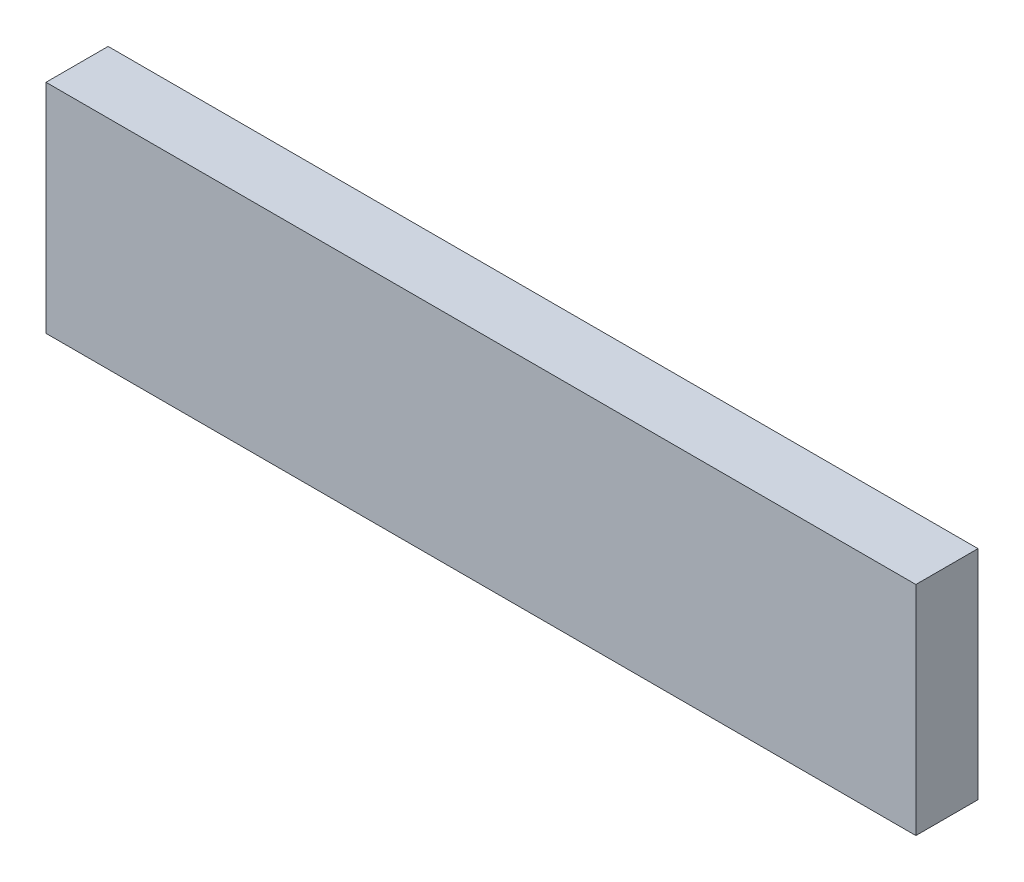
ISO-10303-21;
HEADER;
FILE_DESCRIPTION(('STEP AP214'),'2;1');
FILE_NAME('part.step','',(''),(''),'','','');
FILE_SCHEMA(('AUTOMOTIVE_DESIGN { 1 0 10303 214 1 1 1 1 }'));
ENDSEC;
DATA;
#1=APPLICATION_CONTEXT('core data for automotive mechanical design processes');
#2=APPLICATION_PROTOCOL_DEFINITION('international standard','automotive_design',2000,#1);
#3=PRODUCT_CONTEXT('',#1,'mechanical');
#4=PRODUCT('Part','Part','',(#3));
#5=PRODUCT_RELATED_PRODUCT_CATEGORY('part','',(#4));
#6=PRODUCT_DEFINITION_FORMATION('','',#4);
#7=PRODUCT_DEFINITION_CONTEXT('part definition',#1,'design');
#8=PRODUCT_DEFINITION('design','',#6,#7);
#9=PRODUCT_DEFINITION_SHAPE('','',#8);
#10=(LENGTH_UNIT() NAMED_UNIT(*) SI_UNIT(.MILLI.,.METRE.));
#11=(NAMED_UNIT(*) PLANE_ANGLE_UNIT() SI_UNIT($,.RADIAN.));
#12=(NAMED_UNIT(*) SI_UNIT($,.STERADIAN.) SOLID_ANGLE_UNIT());
#13=UNCERTAINTY_MEASURE_WITH_UNIT(LENGTH_MEASURE(1.E-05),#10,'distance_accuracy_value','');
#14=(GEOMETRIC_REPRESENTATION_CONTEXT(3) GLOBAL_UNCERTAINTY_ASSIGNED_CONTEXT((#13)) GLOBAL_UNIT_ASSIGNED_CONTEXT((#10,
#11,#12)) REPRESENTATION_CONTEXT('',''));
#15=CARTESIAN_POINT('',(0.,0.,0.));
#16=DIRECTION('',(0.,0.,1.));
#17=DIRECTION('',(1.,0.,0.));
#18=AXIS2_PLACEMENT_3D('',#15,#16,#17);
#19=CARTESIAN_POINT('',(140.,-35.,20.));
#20=DIRECTION('',(-1.,0.,0.));
#21=DIRECTION('',(0.,0.,1.));
#22=AXIS2_PLACEMENT_3D('',#19,#20,#21);
#23=PLANE('',#22);
#24=DIRECTION('',(0.,1.,0.));
#25=VECTOR('',#24,1.);
#26=CARTESIAN_POINT('',(140.,-35.,0.));
#27=LINE('',#26,#25);
#28=CARTESIAN_POINT('',(140.,-35.,0.));
#29=VERTEX_POINT('',#28);
#30=CARTESIAN_POINT('',(140.,35.,0.));
#31=VERTEX_POINT('',#30);
#32=EDGE_CURVE('E113',#29,#31,#27,.T.);
#33=ORIENTED_EDGE('',*,*,#32,.T.);
#34=DIRECTION('',(0.,0.,-1.));
#35=VECTOR('',#34,1.);
#36=CARTESIAN_POINT('',(140.,35.,20.));
#37=LINE('',#36,#35);
#38=CARTESIAN_POINT('',(140.,35.,20.));
#39=VERTEX_POINT('',#38);
#40=EDGE_CURVE('E11',#39,#31,#37,.T.);
#41=ORIENTED_EDGE('',*,*,#40,.F.);
#42=DIRECTION('',(0.,1.,0.));
#43=VECTOR('',#42,1.);
#44=CARTESIAN_POINT('',(140.,-35.,20.));
#45=LINE('',#44,#43);
#46=CARTESIAN_POINT('',(140.,-35.,20.));
#47=VERTEX_POINT('',#46);
#48=EDGE_CURVE('E97',#47,#39,#45,.T.);
#49=ORIENTED_EDGE('',*,*,#48,.F.);
#50=DIRECTION('',(0.,0.,-1.));
#51=VECTOR('',#50,1.);
#52=CARTESIAN_POINT('',(140.,-35.,20.));
#53=LINE('',#52,#51);
#54=EDGE_CURVE('E109',#47,#29,#53,.T.);
#55=ORIENTED_EDGE('',*,*,#54,.T.);
#56=EDGE_LOOP('',(#33,#41,#49,#55));
#57=FACE_BOUND('',#56,.T.);
#58=ADVANCED_FACE('F45',(#57),#23,.F.);
#59=CARTESIAN_POINT('',(-140.,35.,20.));
#60=DIRECTION('',(0.,-1.,0.));
#61=DIRECTION('',(0.,0.,-1.));
#62=AXIS2_PLACEMENT_3D('',#59,#60,#61);
#63=PLANE('',#62);
#64=DIRECTION('',(-1.,0.,0.));
#65=VECTOR('',#64,1.);
#66=CARTESIAN_POINT('',(-140.,35.,0.));
#67=LINE('',#66,#65);
#68=CARTESIAN_POINT('',(-140.,35.,0.));
#69=VERTEX_POINT('',#68);
#70=EDGE_CURVE('E102',#31,#69,#67,.T.);
#71=ORIENTED_EDGE('',*,*,#70,.T.);
#72=DIRECTION('',(0.,0.,-1.));
#73=VECTOR('',#72,1.);
#74=CARTESIAN_POINT('',(-140.,35.,20.));
#75=LINE('',#74,#73);
#76=CARTESIAN_POINT('',(-140.,35.,20.));
#77=VERTEX_POINT('',#76);
#78=EDGE_CURVE('E54',#77,#69,#75,.T.);
#79=ORIENTED_EDGE('',*,*,#78,.F.);
#80=DIRECTION('',(-1.,0.,0.));
#81=VECTOR('',#80,1.);
#82=CARTESIAN_POINT('',(-140.,35.,20.));
#83=LINE('',#82,#81);
#84=EDGE_CURVE('E92',#39,#77,#83,.T.);
#85=ORIENTED_EDGE('',*,*,#84,.F.);
#86=ORIENTED_EDGE('',*,*,#40,.T.);
#87=EDGE_LOOP('',(#71,#79,#85,#86));
#88=FACE_BOUND('',#87,.T.);
#89=ADVANCED_FACE('F101',(#88),#63,.F.);
#90=CARTESIAN_POINT('',(-140.,-35.,20.));
#91=DIRECTION('',(1.,0.,0.));
#92=DIRECTION('',(0.,0.,-1.));
#93=AXIS2_PLACEMENT_3D('',#90,#91,#92);
#94=PLANE('',#93);
#95=DIRECTION('',(0.,-1.,0.));
#96=VECTOR('',#95,1.);
#97=CARTESIAN_POINT('',(-140.,-35.,0.));
#98=LINE('',#97,#96);
#99=CARTESIAN_POINT('',(-140.,-35.,0.));
#100=VERTEX_POINT('',#99);
#101=EDGE_CURVE('E79',#69,#100,#98,.T.);
#102=ORIENTED_EDGE('',*,*,#101,.T.);
#103=DIRECTION('',(0.,0.,-1.));
#104=VECTOR('',#103,1.);
#105=CARTESIAN_POINT('',(-140.,-35.,20.));
#106=LINE('',#105,#104);
#107=CARTESIAN_POINT('',(-140.,-35.,20.));
#108=VERTEX_POINT('',#107);
#109=EDGE_CURVE('E104',#108,#100,#106,.T.);
#110=ORIENTED_EDGE('',*,*,#109,.F.);
#111=DIRECTION('',(0.,-1.,0.));
#112=VECTOR('',#111,1.);
#113=CARTESIAN_POINT('',(-140.,-35.,20.));
#114=LINE('',#113,#112);
#115=EDGE_CURVE('E95',#77,#108,#114,.T.);
#116=ORIENTED_EDGE('',*,*,#115,.F.);
#117=ORIENTED_EDGE('',*,*,#78,.T.);
#118=EDGE_LOOP('',(#102,#110,#116,#117));
#119=FACE_BOUND('',#118,.T.);
#120=ADVANCED_FACE('F105',(#119),#94,.F.);
#121=CARTESIAN_POINT('',(-140.,-35.,20.));
#122=DIRECTION('',(0.,1.,0.));
#123=DIRECTION('',(0.,0.,1.));
#124=AXIS2_PLACEMENT_3D('',#121,#122,#123);
#125=PLANE('',#124);
#126=DIRECTION('',(1.,0.,0.));
#127=VECTOR('',#126,1.);
#128=CARTESIAN_POINT('',(-140.,-35.,0.));
#129=LINE('',#128,#127);
#130=EDGE_CURVE('E85',#100,#29,#129,.T.);
#131=ORIENTED_EDGE('',*,*,#130,.T.);
#132=ORIENTED_EDGE('',*,*,#54,.F.);
#133=DIRECTION('',(1.,0.,0.));
#134=VECTOR('',#133,1.);
#135=CARTESIAN_POINT('',(-140.,-35.,20.));
#136=LINE('',#135,#134);
#137=EDGE_CURVE('E62',#108,#47,#136,.T.);
#138=ORIENTED_EDGE('',*,*,#137,.F.);
#139=ORIENTED_EDGE('',*,*,#109,.T.);
#140=EDGE_LOOP('',(#131,#132,#138,#139));
#141=FACE_BOUND('',#140,.T.);
#142=ADVANCED_FACE('F126',(#141),#125,.F.);
#143=CARTESIAN_POINT('',(0.,0.,20.));
#144=DIRECTION('',(0.,0.,-1.));
#145=DIRECTION('',(-1.,0.,0.));
#146=AXIS2_PLACEMENT_3D('',#143,#144,#145);
#147=PLANE('',#146);
#148=ORIENTED_EDGE('',*,*,#48,.T.);
#149=ORIENTED_EDGE('',*,*,#84,.T.);
#150=ORIENTED_EDGE('',*,*,#115,.T.);
#151=ORIENTED_EDGE('',*,*,#137,.T.);
#152=EDGE_LOOP('',(#148,#149,#150,#151));
#153=FACE_BOUND('',#152,.T.);
#154=ADVANCED_FACE('F93',(#153),#147,.F.);
#155=CARTESIAN_POINT('',(0.,0.,0.));
#156=DIRECTION('',(0.,0.,-1.));
#157=DIRECTION('',(-1.,0.,0.));
#158=AXIS2_PLACEMENT_3D('',#155,#156,#157);
#159=PLANE('',#158);
#160=ORIENTED_EDGE('',*,*,#32,.F.);
#161=ORIENTED_EDGE('',*,*,#130,.F.);
#162=ORIENTED_EDGE('',*,*,#101,.F.);
#163=ORIENTED_EDGE('',*,*,#70,.F.);
#164=EDGE_LOOP('',(#160,#161,#162,#163));
#165=FACE_BOUND('',#164,.T.);
#166=ADVANCED_FACE('F129',(#165),#159,.T.);
#167=CLOSED_SHELL('',(#58,#89,#120,#142,#154,#166));
#168=MANIFOLD_SOLID_BREP('B2',#167);
#169=ADVANCED_BREP_SHAPE_REPRESENTATION('',(#18,#168),#14);
#170=SHAPE_DEFINITION_REPRESENTATION(#9,#169);
ENDSEC;
END-ISO-10303-21;
